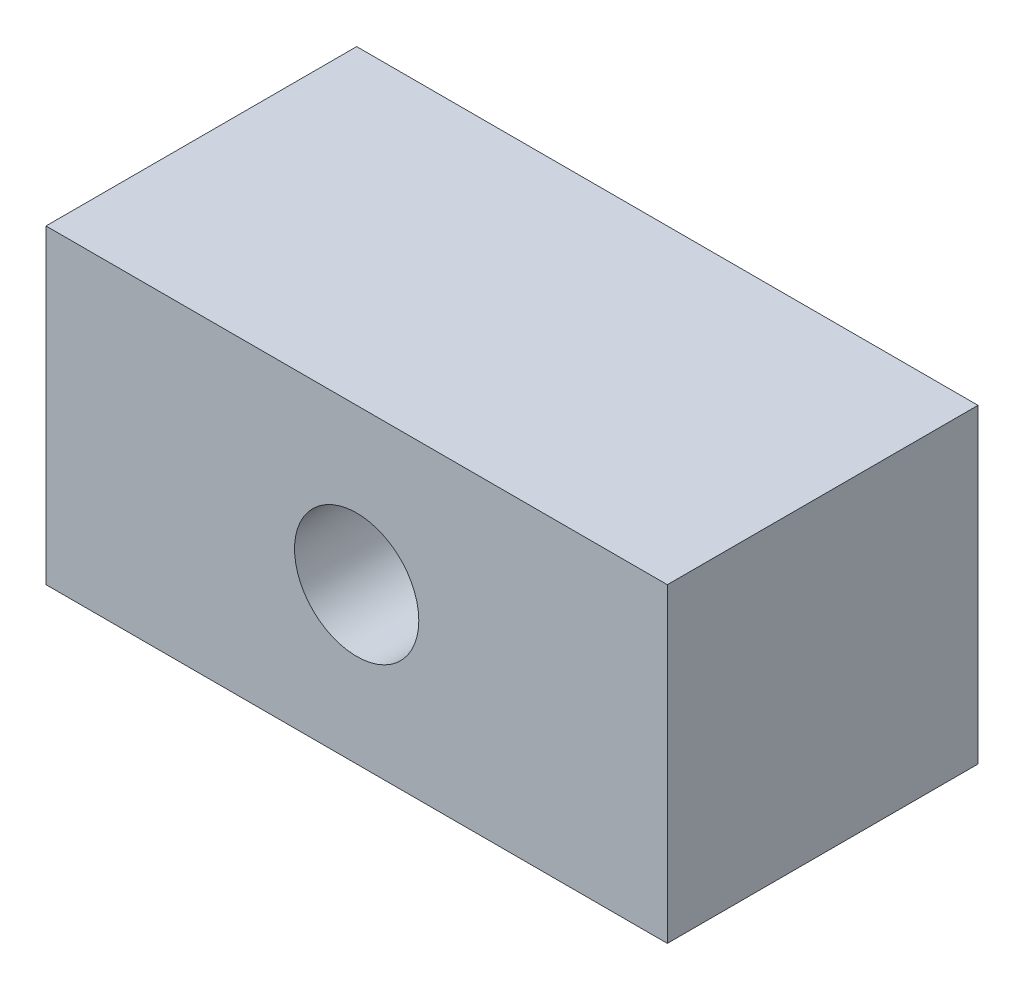
ISO-10303-21;
HEADER;
FILE_DESCRIPTION(('STEP AP214'),'2;1');
FILE_NAME('part.step','',(''),(''),'','','');
FILE_SCHEMA(('AUTOMOTIVE_DESIGN { 1 0 10303 214 1 1 1 1 }'));
ENDSEC;
DATA;
#1=APPLICATION_CONTEXT('core data for automotive mechanical design processes');
#2=APPLICATION_PROTOCOL_DEFINITION('international standard','automotive_design',2000,#1);
#3=PRODUCT_CONTEXT('',#1,'mechanical');
#4=PRODUCT('Part','Part','',(#3));
#5=PRODUCT_RELATED_PRODUCT_CATEGORY('part','',(#4));
#6=PRODUCT_DEFINITION_FORMATION('','',#4);
#7=PRODUCT_DEFINITION_CONTEXT('part definition',#1,'design');
#8=PRODUCT_DEFINITION('design','',#6,#7);
#9=PRODUCT_DEFINITION_SHAPE('','',#8);
#10=(LENGTH_UNIT() NAMED_UNIT(*) SI_UNIT(.MILLI.,.METRE.));
#11=(NAMED_UNIT(*) PLANE_ANGLE_UNIT() SI_UNIT($,.RADIAN.));
#12=(NAMED_UNIT(*) SI_UNIT($,.STERADIAN.) SOLID_ANGLE_UNIT());
#13=UNCERTAINTY_MEASURE_WITH_UNIT(LENGTH_MEASURE(1.E-05),#10,'distance_accuracy_value','');
#14=(GEOMETRIC_REPRESENTATION_CONTEXT(3) GLOBAL_UNCERTAINTY_ASSIGNED_CONTEXT((#13)) GLOBAL_UNIT_ASSIGNED_CONTEXT((#10,
#11,#12)) REPRESENTATION_CONTEXT('',''));
#15=CARTESIAN_POINT('',(0.,0.,0.));
#16=DIRECTION('',(0.,0.,1.));
#17=DIRECTION('',(1.,0.,0.));
#18=AXIS2_PLACEMENT_3D('',#15,#16,#17);
#19=CARTESIAN_POINT('',(0.,20.,10.));
#20=DIRECTION('',(1.,0.,0.));
#21=DIRECTION('',(0.,0.,-1.));
#22=AXIS2_PLACEMENT_3D('',#19,#20,#21);
#23=PLANE('',#22);
#24=DIRECTION('',(0.,-1.,0.));
#25=VECTOR('',#24,1.);
#26=CARTESIAN_POINT('',(0.,20.,-10.));
#27=LINE('',#26,#25);
#28=CARTESIAN_POINT('',(0.,20.,-10.));
#29=VERTEX_POINT('',#28);
#30=CARTESIAN_POINT('',(0.,0.,-10.));
#31=VERTEX_POINT('',#30);
#32=EDGE_CURVE('E104',#29,#31,#27,.T.);
#33=ORIENTED_EDGE('',*,*,#32,.T.);
#34=DIRECTION('',(0.,0.,-1.));
#35=VECTOR('',#34,1.);
#36=CARTESIAN_POINT('',(0.,0.,10.));
#37=LINE('',#36,#35);
#38=CARTESIAN_POINT('',(0.,0.,10.));
#39=VERTEX_POINT('',#38);
#40=EDGE_CURVE('E11',#39,#31,#37,.T.);
#41=ORIENTED_EDGE('',*,*,#40,.F.);
#42=DIRECTION('',(0.,-1.,0.));
#43=VECTOR('',#42,1.);
#44=CARTESIAN_POINT('',(0.,20.,10.));
#45=LINE('',#44,#43);
#46=CARTESIAN_POINT('',(0.,20.,10.));
#47=VERTEX_POINT('',#46);
#48=EDGE_CURVE('E92',#47,#39,#45,.T.);
#49=ORIENTED_EDGE('',*,*,#48,.F.);
#50=DIRECTION('',(0.,0.,-1.));
#51=VECTOR('',#50,1.);
#52=CARTESIAN_POINT('',(0.,20.,10.));
#53=LINE('',#52,#51);
#54=EDGE_CURVE('E100',#47,#29,#53,.T.);
#55=ORIENTED_EDGE('',*,*,#54,.T.);
#56=EDGE_LOOP('',(#33,#41,#49,#55));
#57=FACE_BOUND('',#56,.T.);
#58=ADVANCED_FACE('F41',(#57),#23,.F.);
#59=CARTESIAN_POINT('',(0.,0.,10.));
#60=DIRECTION('',(0.,1.,0.));
#61=DIRECTION('',(0.,0.,1.));
#62=AXIS2_PLACEMENT_3D('',#59,#60,#61);
#63=PLANE('',#62);
#64=DIRECTION('',(1.,0.,0.));
#65=VECTOR('',#64,1.);
#66=CARTESIAN_POINT('',(0.,0.,-10.));
#67=LINE('',#66,#65);
#68=CARTESIAN_POINT('',(40.,0.,-10.));
#69=VERTEX_POINT('',#68);
#70=EDGE_CURVE('E96',#31,#69,#67,.T.);
#71=ORIENTED_EDGE('',*,*,#70,.T.);
#72=DIRECTION('',(0.,0.,-1.));
#73=VECTOR('',#72,1.);
#74=CARTESIAN_POINT('',(40.,0.,10.));
#75=LINE('',#74,#73);
#76=CARTESIAN_POINT('',(40.,0.,10.));
#77=VERTEX_POINT('',#76);
#78=EDGE_CURVE('E49',#77,#69,#75,.T.);
#79=ORIENTED_EDGE('',*,*,#78,.F.);
#80=DIRECTION('',(1.,0.,0.));
#81=VECTOR('',#80,1.);
#82=CARTESIAN_POINT('',(0.,0.,10.));
#83=LINE('',#82,#81);
#84=EDGE_CURVE('E87',#39,#77,#83,.T.);
#85=ORIENTED_EDGE('',*,*,#84,.F.);
#86=ORIENTED_EDGE('',*,*,#40,.T.);
#87=EDGE_LOOP('',(#71,#79,#85,#86));
#88=FACE_BOUND('',#87,.T.);
#89=ADVANCED_FACE('F95',(#88),#63,.F.);
#90=CARTESIAN_POINT('',(40.,0.,10.));
#91=DIRECTION('',(-1.,0.,0.));
#92=DIRECTION('',(0.,0.,1.));
#93=AXIS2_PLACEMENT_3D('',#90,#91,#92);
#94=PLANE('',#93);
#95=DIRECTION('',(0.,1.,0.));
#96=VECTOR('',#95,1.);
#97=CARTESIAN_POINT('',(40.,0.,-10.));
#98=LINE('',#97,#96);
#99=CARTESIAN_POINT('',(40.,20.,-10.));
#100=VERTEX_POINT('',#99);
#101=EDGE_CURVE('E74',#69,#100,#98,.T.);
#102=ORIENTED_EDGE('',*,*,#101,.T.);
#103=DIRECTION('',(0.,0.,-1.));
#104=VECTOR('',#103,1.);
#105=CARTESIAN_POINT('',(40.,20.,10.));
#106=LINE('',#105,#104);
#107=CARTESIAN_POINT('',(40.,20.,10.));
#108=VERTEX_POINT('',#107);
#109=EDGE_CURVE('E97',#108,#100,#106,.T.);
#110=ORIENTED_EDGE('',*,*,#109,.F.);
#111=DIRECTION('',(0.,1.,0.));
#112=VECTOR('',#111,1.);
#113=CARTESIAN_POINT('',(40.,0.,10.));
#114=LINE('',#113,#112);
#115=EDGE_CURVE('E90',#77,#108,#114,.T.);
#116=ORIENTED_EDGE('',*,*,#115,.F.);
#117=ORIENTED_EDGE('',*,*,#78,.T.);
#118=EDGE_LOOP('',(#102,#110,#116,#117));
#119=FACE_BOUND('',#118,.T.);
#120=ADVANCED_FACE('F98',(#119),#94,.F.);
#121=CARTESIAN_POINT('',(40.,20.,10.));
#122=DIRECTION('',(0.,-1.,0.));
#123=DIRECTION('',(0.,0.,-1.));
#124=AXIS2_PLACEMENT_3D('',#121,#122,#123);
#125=PLANE('',#124);
#126=DIRECTION('',(-1.,0.,0.));
#127=VECTOR('',#126,1.);
#128=CARTESIAN_POINT('',(40.,20.,-10.));
#129=LINE('',#128,#127);
#130=EDGE_CURVE('E80',#100,#29,#129,.T.);
#131=ORIENTED_EDGE('',*,*,#130,.T.);
#132=ORIENTED_EDGE('',*,*,#54,.F.);
#133=DIRECTION('',(-1.,0.,0.));
#134=VECTOR('',#133,1.);
#135=CARTESIAN_POINT('',(40.,20.,10.));
#136=LINE('',#135,#134);
#137=EDGE_CURVE('E57',#108,#47,#136,.T.);
#138=ORIENTED_EDGE('',*,*,#137,.F.);
#139=ORIENTED_EDGE('',*,*,#109,.T.);
#140=EDGE_LOOP('',(#131,#132,#138,#139));
#141=FACE_BOUND('',#140,.T.);
#142=ADVANCED_FACE('F112',(#141),#125,.F.);
#143=CARTESIAN_POINT('',(0.,0.,10.));
#144=DIRECTION('',(0.,0.,1.));
#145=DIRECTION('',(1.,0.,0.));
#146=AXIS2_PLACEMENT_3D('',#143,#144,#145);
#147=PLANE('',#146);
#148=CARTESIAN_POINT('',(20.,10.,10.));
#149=DIRECTION('',(0.,0.,1.));
#150=DIRECTION('',(1.,0.,0.));
#151=AXIS2_PLACEMENT_3D('',#148,#149,#150);
#152=CIRCLE('',#151,4.);
#153=CARTESIAN_POINT('',(24.,10.,10.));
#154=VERTEX_POINT('',#153);
#155=EDGE_CURVE('E107',#154,#154,#152,.T.);
#156=ORIENTED_EDGE('',*,*,#155,.F.);
#157=EDGE_LOOP('',(#156));
#158=FACE_BOUND('',#157,.T.);
#159=ORIENTED_EDGE('',*,*,#48,.T.);
#160=ORIENTED_EDGE('',*,*,#84,.T.);
#161=ORIENTED_EDGE('',*,*,#115,.T.);
#162=ORIENTED_EDGE('',*,*,#137,.T.);
#163=EDGE_LOOP('',(#159,#160,#161,#162));
#164=FACE_BOUND('',#163,.T.);
#165=ADVANCED_FACE('F88',(#158,#164),#147,.T.);
#166=CARTESIAN_POINT('',(0.,0.,-10.));
#167=DIRECTION('',(0.,0.,1.));
#168=DIRECTION('',(1.,0.,0.));
#169=AXIS2_PLACEMENT_3D('',#166,#167,#168);
#170=PLANE('',#169);
#171=ORIENTED_EDGE('',*,*,#32,.F.);
#172=ORIENTED_EDGE('',*,*,#130,.F.);
#173=ORIENTED_EDGE('',*,*,#101,.F.);
#174=ORIENTED_EDGE('',*,*,#70,.F.);
#175=EDGE_LOOP('',(#171,#172,#173,#174));
#176=FACE_BOUND('',#175,.T.);
#177=ADVANCED_FACE('F115',(#176),#170,.F.);
#178=CARTESIAN_POINT('',(20.,10.,10.));
#179=DIRECTION('',(0.,0.,-1.));
#180=DIRECTION('',(-1.,0.,0.));
#181=AXIS2_PLACEMENT_3D('',#178,#179,#180);
#182=CYLINDRICAL_SURFACE('',#181,4.);
#183=ORIENTED_EDGE('',*,*,#155,.T.);
#184=EDGE_LOOP('',(#183));
#185=FACE_BOUND('',#184,.T.);
#186=CARTESIAN_POINT('',(20.,10.,0.));
#187=DIRECTION('',(0.,0.,1.));
#188=DIRECTION('',(1.,0.,0.));
#189=AXIS2_PLACEMENT_3D('',#186,#187,#188);
#190=CIRCLE('',#189,4.);
#191=CARTESIAN_POINT('',(24.,10.,0.));
#192=VERTEX_POINT('',#191);
#193=EDGE_CURVE('E118',#192,#192,#190,.T.);
#194=ORIENTED_EDGE('',*,*,#193,.F.);
#195=EDGE_LOOP('',(#194));
#196=FACE_BOUND('',#195,.T.);
#197=ADVANCED_FACE('F124',(#185,#196),#182,.F.);
#198=CARTESIAN_POINT('',(20.,10.,0.));
#199=DIRECTION('',(0.,0.,1.));
#200=DIRECTION('',(1.,0.,0.));
#201=AXIS2_PLACEMENT_3D('',#198,#199,#200);
#202=PLANE('',#201);
#203=ORIENTED_EDGE('',*,*,#193,.T.);
#204=EDGE_LOOP('',(#203));
#205=FACE_BOUND('',#204,.T.);
#206=ADVANCED_FACE('F169',(#205),#202,.T.);
#207=CLOSED_SHELL('',(#58,#89,#120,#142,#165,#177,#197,#206));
#208=MANIFOLD_SOLID_BREP('B2',#207);
#209=ADVANCED_BREP_SHAPE_REPRESENTATION('',(#18,#208),#14);
#210=SHAPE_DEFINITION_REPRESENTATION(#9,#209);
ENDSEC;
END-ISO-10303-21;
